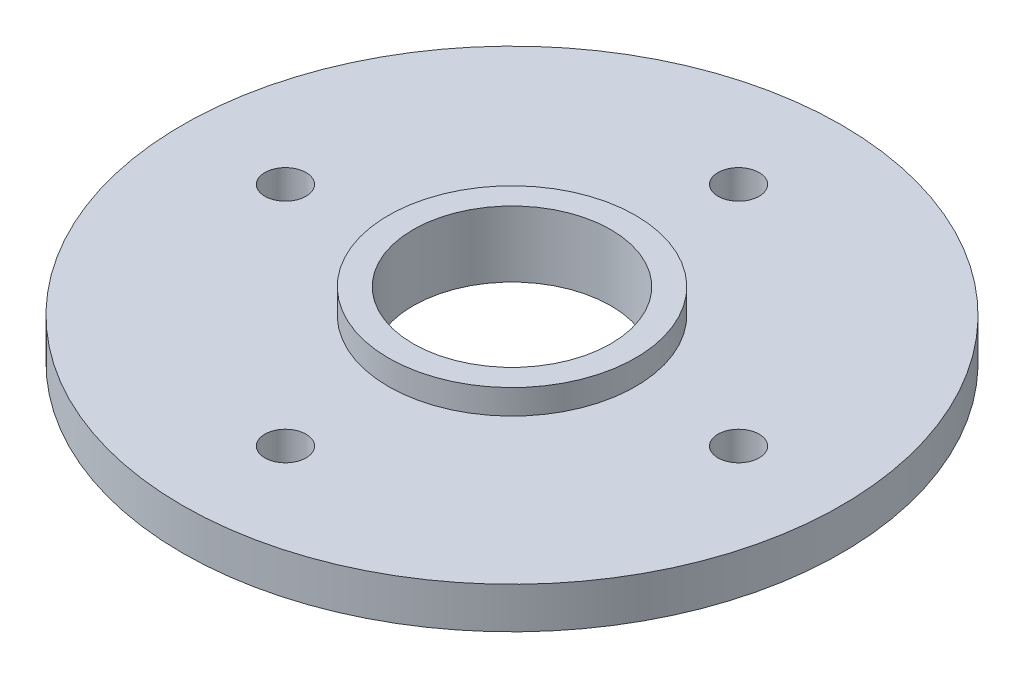
ISO-10303-21;
HEADER;
FILE_DESCRIPTION(('STEP AP214'),'2;1');
FILE_NAME('part.step','',(''),(''),'','','');
FILE_SCHEMA(('AUTOMOTIVE_DESIGN { 1 0 10303 214 1 1 1 1 }'));
ENDSEC;
DATA;
#1=APPLICATION_CONTEXT('core data for automotive mechanical design processes');
#2=APPLICATION_PROTOCOL_DEFINITION('international standard','automotive_design',2000,#1);
#3=PRODUCT_CONTEXT('',#1,'mechanical');
#4=PRODUCT('Part','Part','',(#3));
#5=PRODUCT_RELATED_PRODUCT_CATEGORY('part','',(#4));
#6=PRODUCT_DEFINITION_FORMATION('','',#4);
#7=PRODUCT_DEFINITION_CONTEXT('part definition',#1,'design');
#8=PRODUCT_DEFINITION('design','',#6,#7);
#9=PRODUCT_DEFINITION_SHAPE('','',#8);
#10=(LENGTH_UNIT() NAMED_UNIT(*) SI_UNIT(.MILLI.,.METRE.));
#11=(NAMED_UNIT(*) PLANE_ANGLE_UNIT() SI_UNIT($,.RADIAN.));
#12=(NAMED_UNIT(*) SI_UNIT($,.STERADIAN.) SOLID_ANGLE_UNIT());
#13=UNCERTAINTY_MEASURE_WITH_UNIT(LENGTH_MEASURE(1.E-05),#10,'distance_accuracy_value','');
#14=(GEOMETRIC_REPRESENTATION_CONTEXT(3) GLOBAL_UNCERTAINTY_ASSIGNED_CONTEXT((#13)) GLOBAL_UNIT_ASSIGNED_CONTEXT((#10,
#11,#12)) REPRESENTATION_CONTEXT('',''));
#15=CARTESIAN_POINT('',(0.,0.,0.));
#16=DIRECTION('',(0.,0.,1.));
#17=DIRECTION('',(1.,0.,0.));
#18=AXIS2_PLACEMENT_3D('',#15,#16,#17);
#19=CARTESIAN_POINT('',(0.,5.,0.));
#20=DIRECTION('',(0.,-1.,0.));
#21=DIRECTION('',(0.,0.,-1.));
#22=AXIS2_PLACEMENT_3D('',#19,#20,#21);
#23=CYLINDRICAL_SURFACE('',#22,40.);
#24=CARTESIAN_POINT('',(0.,5.,0.));
#25=DIRECTION('',(0.,1.,0.));
#26=DIRECTION('',(0.,0.,1.));
#27=AXIS2_PLACEMENT_3D('',#24,#25,#26);
#28=CIRCLE('',#27,40.);
#29=CARTESIAN_POINT('',(0.,5.,40.));
#30=VERTEX_POINT('',#29);
#31=EDGE_CURVE('E10',#30,#30,#28,.T.);
#32=ORIENTED_EDGE('',*,*,#31,.F.);
#33=EDGE_LOOP('',(#32));
#34=FACE_BOUND('',#33,.T.);
#35=CARTESIAN_POINT('',(0.,0.,0.));
#36=DIRECTION('',(0.,1.,0.));
#37=DIRECTION('',(0.,0.,1.));
#38=AXIS2_PLACEMENT_3D('',#35,#36,#37);
#39=CIRCLE('',#38,40.);
#40=CARTESIAN_POINT('',(0.,0.,40.));
#41=VERTEX_POINT('',#40);
#42=EDGE_CURVE('E33',#41,#41,#39,.T.);
#43=ORIENTED_EDGE('',*,*,#42,.T.);
#44=EDGE_LOOP('',(#43));
#45=FACE_BOUND('',#44,.T.);
#46=ADVANCED_FACE('F30',(#34,#45),#23,.T.);
#47=CARTESIAN_POINT('',(0.,5.,0.));
#48=DIRECTION('',(0.,1.,0.));
#49=DIRECTION('',(0.,0.,1.));
#50=AXIS2_PLACEMENT_3D('',#47,#48,#49);
#51=PLANE('',#50);
#52=CARTESIAN_POINT('',(27.5,5.,-2.88047210454558E-13));
#53=DIRECTION('',(0.,1.,0.));
#54=DIRECTION('',(0.,0.,1.));
#55=AXIS2_PLACEMENT_3D('',#52,#53,#54);
#56=CIRCLE('',#55,2.49999999999999);
#57=CARTESIAN_POINT('',(27.5,5.,2.4999999999997));
#58=VERTEX_POINT('',#57);
#59=EDGE_CURVE('E74',#58,#58,#56,.T.);
#60=ORIENTED_EDGE('',*,*,#59,.F.);
#61=EDGE_LOOP('',(#60));
#62=FACE_BOUND('',#61,.T.);
#63=CARTESIAN_POINT('',(0.,5.,27.5));
#64=DIRECTION('',(0.,1.,0.));
#65=DIRECTION('',(0.,0.,1.));
#66=AXIS2_PLACEMENT_3D('',#63,#64,#65);
#67=CIRCLE('',#66,2.49999999999999);
#68=CARTESIAN_POINT('',(0.,5.,30.));
#69=VERTEX_POINT('',#68);
#70=EDGE_CURVE('E68',#69,#69,#67,.T.);
#71=ORIENTED_EDGE('',*,*,#70,.F.);
#72=EDGE_LOOP('',(#71));
#73=FACE_BOUND('',#72,.T.);
#74=CARTESIAN_POINT('',(-27.5,5.,0.));
#75=DIRECTION('',(0.,1.,0.));
#76=DIRECTION('',(0.,0.,1.));
#77=AXIS2_PLACEMENT_3D('',#74,#75,#76);
#78=CIRCLE('',#77,2.49999999999999);
#79=CARTESIAN_POINT('',(-27.5,5.,2.50000000000009));
#80=VERTEX_POINT('',#79);
#81=EDGE_CURVE('E62',#80,#80,#78,.T.);
#82=ORIENTED_EDGE('',*,*,#81,.F.);
#83=EDGE_LOOP('',(#82));
#84=FACE_BOUND('',#83,.T.);
#85=CARTESIAN_POINT('',(0.,5.,-27.5));
#86=DIRECTION('',(0.,1.,0.));
#87=DIRECTION('',(0.,0.,1.));
#88=AXIS2_PLACEMENT_3D('',#85,#86,#87);
#89=CIRCLE('',#88,2.49999999999999);
#90=CARTESIAN_POINT('',(0.,5.,-25.));
#91=VERTEX_POINT('',#90);
#92=EDGE_CURVE('E56',#91,#91,#89,.T.);
#93=ORIENTED_EDGE('',*,*,#92,.F.);
#94=EDGE_LOOP('',(#93));
#95=FACE_BOUND('',#94,.T.);
#96=CARTESIAN_POINT('',(0.,5.,0.));
#97=DIRECTION('',(0.,1.,0.));
#98=DIRECTION('',(0.,0.,1.));
#99=AXIS2_PLACEMENT_3D('',#96,#97,#98);
#100=CIRCLE('',#99,15.);
#101=CARTESIAN_POINT('',(0.,5.,15.));
#102=VERTEX_POINT('',#101);
#103=EDGE_CURVE('E42',#102,#102,#100,.T.);
#104=ORIENTED_EDGE('',*,*,#103,.F.);
#105=EDGE_LOOP('',(#104));
#106=FACE_BOUND('',#105,.T.);
#107=ORIENTED_EDGE('',*,*,#31,.T.);
#108=EDGE_LOOP('',(#107));
#109=FACE_BOUND('',#108,.T.);
#110=ADVANCED_FACE('F80',(#62,#73,#84,#95,#106,#109),#51,.T.);
#111=CARTESIAN_POINT('',(0.,0.,0.));
#112=DIRECTION('',(0.,1.,0.));
#113=DIRECTION('',(0.,0.,1.));
#114=AXIS2_PLACEMENT_3D('',#111,#112,#113);
#115=PLANE('',#114);
#116=CARTESIAN_POINT('',(27.5,0.,-2.88047210454558E-13));
#117=DIRECTION('',(0.,1.,0.));
#118=DIRECTION('',(0.,0.,1.));
#119=AXIS2_PLACEMENT_3D('',#116,#117,#118);
#120=CIRCLE('',#119,2.49999999999999);
#121=CARTESIAN_POINT('',(27.5,0.,2.4999999999997));
#122=VERTEX_POINT('',#121);
#123=EDGE_CURVE('E71',#122,#122,#120,.T.);
#124=ORIENTED_EDGE('',*,*,#123,.T.);
#125=EDGE_LOOP('',(#124));
#126=FACE_BOUND('',#125,.T.);
#127=CARTESIAN_POINT('',(0.,0.,27.5));
#128=DIRECTION('',(0.,1.,0.));
#129=DIRECTION('',(0.,0.,1.));
#130=AXIS2_PLACEMENT_3D('',#127,#128,#129);
#131=CIRCLE('',#130,2.49999999999999);
#132=CARTESIAN_POINT('',(0.,0.,30.));
#133=VERTEX_POINT('',#132);
#134=EDGE_CURVE('E65',#133,#133,#131,.T.);
#135=ORIENTED_EDGE('',*,*,#134,.T.);
#136=EDGE_LOOP('',(#135));
#137=FACE_BOUND('',#136,.T.);
#138=CARTESIAN_POINT('',(-27.5,0.,0.));
#139=DIRECTION('',(0.,1.,0.));
#140=DIRECTION('',(0.,0.,1.));
#141=AXIS2_PLACEMENT_3D('',#138,#139,#140);
#142=CIRCLE('',#141,2.49999999999999);
#143=CARTESIAN_POINT('',(-27.5,0.,2.50000000000009));
#144=VERTEX_POINT('',#143);
#145=EDGE_CURVE('E59',#144,#144,#142,.T.);
#146=ORIENTED_EDGE('',*,*,#145,.T.);
#147=EDGE_LOOP('',(#146));
#148=FACE_BOUND('',#147,.T.);
#149=CARTESIAN_POINT('',(0.,0.,-27.5));
#150=DIRECTION('',(0.,1.,0.));
#151=DIRECTION('',(0.,0.,1.));
#152=AXIS2_PLACEMENT_3D('',#149,#150,#151);
#153=CIRCLE('',#152,2.49999999999999);
#154=CARTESIAN_POINT('',(0.,0.,-25.));
#155=VERTEX_POINT('',#154);
#156=EDGE_CURVE('E53',#155,#155,#153,.T.);
#157=ORIENTED_EDGE('',*,*,#156,.T.);
#158=EDGE_LOOP('',(#157));
#159=FACE_BOUND('',#158,.T.);
#160=CARTESIAN_POINT('',(0.,0.,0.));
#161=DIRECTION('',(0.,1.,0.));
#162=DIRECTION('',(0.,0.,1.));
#163=AXIS2_PLACEMENT_3D('',#160,#161,#162);
#164=CIRCLE('',#163,12.);
#165=CARTESIAN_POINT('',(0.,0.,12.));
#166=VERTEX_POINT('',#165);
#167=EDGE_CURVE('E50',#166,#166,#164,.T.);
#168=ORIENTED_EDGE('',*,*,#167,.T.);
#169=EDGE_LOOP('',(#168));
#170=FACE_BOUND('',#169,.T.);
#171=ORIENTED_EDGE('',*,*,#42,.F.);
#172=EDGE_LOOP('',(#171));
#173=FACE_BOUND('',#172,.T.);
#174=ADVANCED_FACE('F83',(#126,#137,#148,#159,#170,#173),#115,.F.);
#175=CARTESIAN_POINT('',(0.,8.,0.));
#176=DIRECTION('',(0.,1.,0.));
#177=DIRECTION('',(0.,0.,1.));
#178=AXIS2_PLACEMENT_3D('',#175,#176,#177);
#179=PLANE('',#178);
#180=CARTESIAN_POINT('',(0.,8.,0.));
#181=DIRECTION('',(0.,1.,0.));
#182=DIRECTION('',(0.,0.,1.));
#183=AXIS2_PLACEMENT_3D('',#180,#181,#182);
#184=CIRCLE('',#183,15.);
#185=CARTESIAN_POINT('',(0.,8.,15.));
#186=VERTEX_POINT('',#185);
#187=EDGE_CURVE('E40',#186,#186,#184,.T.);
#188=ORIENTED_EDGE('',*,*,#187,.T.);
#189=EDGE_LOOP('',(#188));
#190=FACE_BOUND('',#189,.T.);
#191=CARTESIAN_POINT('',(0.,8.,0.));
#192=DIRECTION('',(0.,1.,0.));
#193=DIRECTION('',(0.,0.,1.));
#194=AXIS2_PLACEMENT_3D('',#191,#192,#193);
#195=CIRCLE('',#194,12.);
#196=CARTESIAN_POINT('',(0.,8.,12.));
#197=VERTEX_POINT('',#196);
#198=EDGE_CURVE('E45',#197,#197,#195,.T.);
#199=ORIENTED_EDGE('',*,*,#198,.F.);
#200=EDGE_LOOP('',(#199));
#201=FACE_BOUND('',#200,.T.);
#202=ADVANCED_FACE('F96',(#190,#201),#179,.T.);
#203=CARTESIAN_POINT('',(0.,8.,0.));
#204=DIRECTION('',(0.,-1.,0.));
#205=DIRECTION('',(0.,0.,-1.));
#206=AXIS2_PLACEMENT_3D('',#203,#204,#205);
#207=CYLINDRICAL_SURFACE('',#206,15.);
#208=ORIENTED_EDGE('',*,*,#187,.F.);
#209=EDGE_LOOP('',(#208));
#210=FACE_BOUND('',#209,.T.);
#211=ORIENTED_EDGE('',*,*,#103,.T.);
#212=EDGE_LOOP('',(#211));
#213=FACE_BOUND('',#212,.T.);
#214=ADVANCED_FACE('F93',(#210,#213),#207,.T.);
#215=CARTESIAN_POINT('',(0.,8.,0.));
#216=DIRECTION('',(0.,-1.,0.));
#217=DIRECTION('',(0.,0.,-1.));
#218=AXIS2_PLACEMENT_3D('',#215,#216,#217);
#219=CYLINDRICAL_SURFACE('',#218,12.);
#220=ORIENTED_EDGE('',*,*,#198,.T.);
#221=EDGE_LOOP('',(#220));
#222=FACE_BOUND('',#221,.T.);
#223=ORIENTED_EDGE('',*,*,#167,.F.);
#224=EDGE_LOOP('',(#223));
#225=FACE_BOUND('',#224,.T.);
#226=ADVANCED_FACE('F95',(#222,#225),#219,.F.);
#227=CARTESIAN_POINT('',(0.,5.,-27.5));
#228=DIRECTION('',(0.,1.,0.));
#229=DIRECTION('',(0.,0.,1.));
#230=AXIS2_PLACEMENT_3D('',#227,#228,#229);
#231=CYLINDRICAL_SURFACE('',#230,2.49999999999999);
#232=ORIENTED_EDGE('',*,*,#156,.F.);
#233=EDGE_LOOP('',(#232));
#234=FACE_BOUND('',#233,.T.);
#235=ORIENTED_EDGE('',*,*,#92,.T.);
#236=EDGE_LOOP('',(#235));
#237=FACE_BOUND('',#236,.T.);
#238=ADVANCED_FACE('F103',(#234,#237),#231,.F.);
#239=CARTESIAN_POINT('',(-27.5,5.,0.));
#240=DIRECTION('',(0.,1.,0.));
#241=DIRECTION('',(0.,0.,1.));
#242=AXIS2_PLACEMENT_3D('',#239,#240,#241);
#243=CYLINDRICAL_SURFACE('',#242,2.49999999999999);
#244=ORIENTED_EDGE('',*,*,#145,.F.);
#245=EDGE_LOOP('',(#244));
#246=FACE_BOUND('',#245,.T.);
#247=ORIENTED_EDGE('',*,*,#81,.T.);
#248=EDGE_LOOP('',(#247));
#249=FACE_BOUND('',#248,.T.);
#250=ADVANCED_FACE('F133',(#246,#249),#243,.F.);
#251=CARTESIAN_POINT('',(0.,5.,27.5));
#252=DIRECTION('',(0.,1.,0.));
#253=DIRECTION('',(0.,0.,1.));
#254=AXIS2_PLACEMENT_3D('',#251,#252,#253);
#255=CYLINDRICAL_SURFACE('',#254,2.49999999999999);
#256=ORIENTED_EDGE('',*,*,#134,.F.);
#257=EDGE_LOOP('',(#256));
#258=FACE_BOUND('',#257,.T.);
#259=ORIENTED_EDGE('',*,*,#70,.T.);
#260=EDGE_LOOP('',(#259));
#261=FACE_BOUND('',#260,.T.);
#262=ADVANCED_FACE('F138',(#258,#261),#255,.F.);
#263=CARTESIAN_POINT('',(27.5,5.,-2.88047210454558E-13));
#264=DIRECTION('',(0.,1.,0.));
#265=DIRECTION('',(0.,0.,1.));
#266=AXIS2_PLACEMENT_3D('',#263,#264,#265);
#267=CYLINDRICAL_SURFACE('',#266,2.49999999999999);
#268=ORIENTED_EDGE('',*,*,#123,.F.);
#269=EDGE_LOOP('',(#268));
#270=FACE_BOUND('',#269,.T.);
#271=ORIENTED_EDGE('',*,*,#59,.T.);
#272=EDGE_LOOP('',(#271));
#273=FACE_BOUND('',#272,.T.);
#274=ADVANCED_FACE('F78',(#270,#273),#267,.F.);
#275=CLOSED_SHELL('',(#46,#110,#174,#202,#214,#226,#238,#250,#262,#274));
#276=MANIFOLD_SOLID_BREP('B2',#275);
#277=ADVANCED_BREP_SHAPE_REPRESENTATION('',(#18,#276),#14);
#278=SHAPE_DEFINITION_REPRESENTATION(#9,#277);
ENDSEC;
END-ISO-10303-21;
